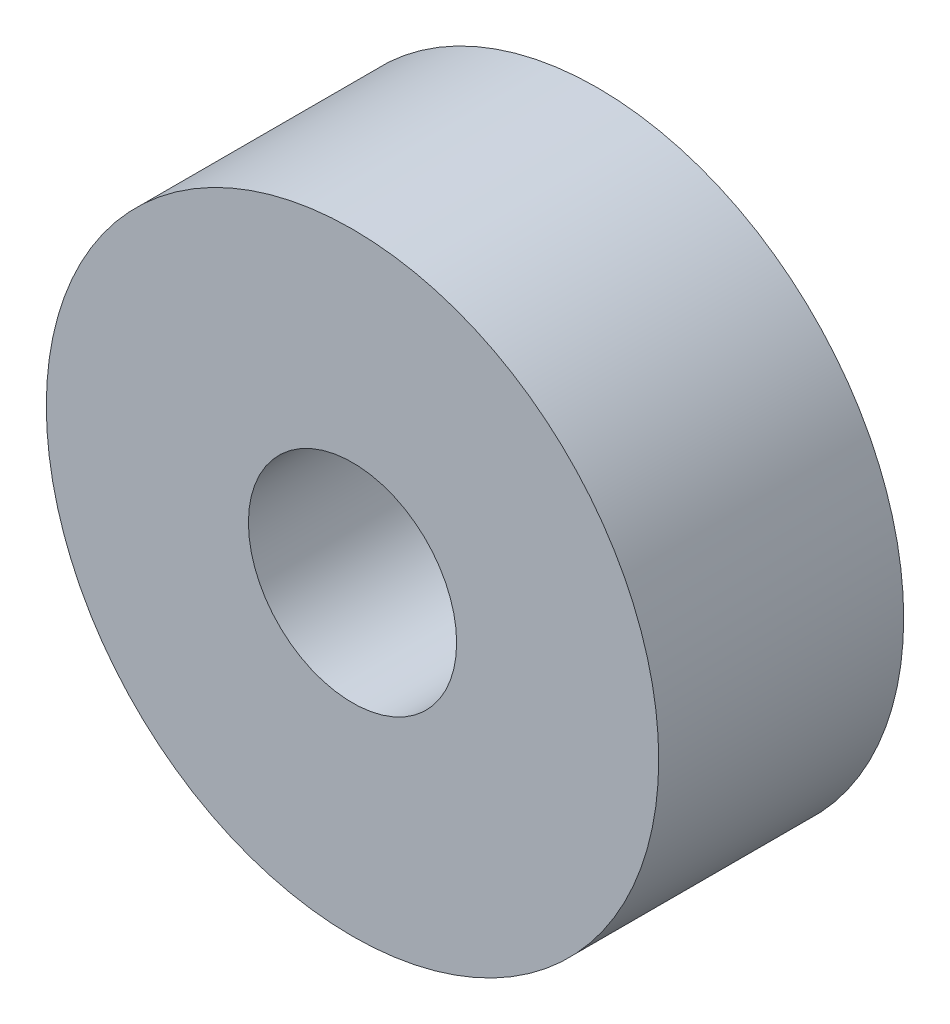
ISO-10303-21;
HEADER;
FILE_DESCRIPTION(('STEP AP214'),'2;1');
FILE_NAME('part.step','',(''),(''),'','','');
FILE_SCHEMA(('AUTOMOTIVE_DESIGN { 1 0 10303 214 1 1 1 1 }'));
ENDSEC;
DATA;
#1=APPLICATION_CONTEXT('core data for automotive mechanical design processes');
#2=APPLICATION_PROTOCOL_DEFINITION('international standard','automotive_design',2000,#1);
#3=PRODUCT_CONTEXT('',#1,'mechanical');
#4=PRODUCT('Part','Part','',(#3));
#5=PRODUCT_RELATED_PRODUCT_CATEGORY('part','',(#4));
#6=PRODUCT_DEFINITION_FORMATION('','',#4);
#7=PRODUCT_DEFINITION_CONTEXT('part definition',#1,'design');
#8=PRODUCT_DEFINITION('design','',#6,#7);
#9=PRODUCT_DEFINITION_SHAPE('','',#8);
#10=(LENGTH_UNIT() NAMED_UNIT(*) SI_UNIT(.MILLI.,.METRE.));
#11=(NAMED_UNIT(*) PLANE_ANGLE_UNIT() SI_UNIT($,.RADIAN.));
#12=(NAMED_UNIT(*) SI_UNIT($,.STERADIAN.) SOLID_ANGLE_UNIT());
#13=UNCERTAINTY_MEASURE_WITH_UNIT(LENGTH_MEASURE(1.E-05),#10,'distance_accuracy_value','');
#14=(GEOMETRIC_REPRESENTATION_CONTEXT(3) GLOBAL_UNCERTAINTY_ASSIGNED_CONTEXT((#13)) GLOBAL_UNIT_ASSIGNED_CONTEXT((#10,
#11,#12)) REPRESENTATION_CONTEXT('',''));
#15=CARTESIAN_POINT('',(0.,0.,0.));
#16=DIRECTION('',(0.,0.,1.));
#17=DIRECTION('',(1.,0.,0.));
#18=AXIS2_PLACEMENT_3D('',#15,#16,#17);
#19=CARTESIAN_POINT('',(0.,-99.9999999999998,-13.));
#20=DIRECTION('',(0.,0.,1.));
#21=DIRECTION('',(1.,0.,0.));
#22=AXIS2_PLACEMENT_3D('',#19,#20,#21);
#23=CYLINDRICAL_SURFACE('',#22,5.);
#24=CARTESIAN_POINT('',(0.,-99.9999999999998,-13.));
#25=DIRECTION('',(0.,0.,-1.));
#26=DIRECTION('',(-1.,0.,0.));
#27=AXIS2_PLACEMENT_3D('',#24,#25,#26);
#28=CIRCLE('',#27,5.);
#29=CARTESIAN_POINT('',(-4.99999999999998,-99.9999999999998,-13.));
#30=VERTEX_POINT('',#29);
#31=EDGE_CURVE('E10',#30,#30,#28,.T.);
#32=ORIENTED_EDGE('',*,*,#31,.F.);
#33=EDGE_LOOP('',(#32));
#34=FACE_BOUND('',#33,.T.);
#35=CARTESIAN_POINT('',(0.,-99.9999999999998,-9.));
#36=DIRECTION('',(0.,0.,-1.));
#37=DIRECTION('',(-1.,0.,0.));
#38=AXIS2_PLACEMENT_3D('',#35,#36,#37);
#39=CIRCLE('',#38,5.);
#40=CARTESIAN_POINT('',(-4.99999999999998,-99.9999999999998,-9.));
#41=VERTEX_POINT('',#40);
#42=EDGE_CURVE('E60',#41,#41,#39,.T.);
#43=ORIENTED_EDGE('',*,*,#42,.T.);
#44=EDGE_LOOP('',(#43));
#45=FACE_BOUND('',#44,.T.);
#46=ADVANCED_FACE('F47',(#34,#45),#23,.T.);
#47=CARTESIAN_POINT('',(0.,-99.9999999999998,-13.));
#48=DIRECTION('',(0.,0.,-1.));
#49=DIRECTION('',(-1.,0.,0.));
#50=AXIS2_PLACEMENT_3D('',#47,#48,#49);
#51=PLANE('',#50);
#52=CARTESIAN_POINT('',(0.,-99.9999999999998,-13.));
#53=DIRECTION('',(0.,0.,-1.));
#54=DIRECTION('',(-1.,0.,0.));
#55=AXIS2_PLACEMENT_3D('',#52,#53,#54);
#56=CIRCLE('',#55,3.15);
#57=CARTESIAN_POINT('',(-3.14999999999998,-99.9999999999998,-13.));
#58=VERTEX_POINT('',#57);
#59=EDGE_CURVE('E68',#58,#58,#56,.T.);
#60=ORIENTED_EDGE('',*,*,#59,.F.);
#61=EDGE_LOOP('',(#60));
#62=FACE_BOUND('',#61,.T.);
#63=ORIENTED_EDGE('',*,*,#31,.T.);
#64=EDGE_LOOP('',(#63));
#65=FACE_BOUND('',#64,.T.);
#66=ADVANCED_FACE('F76',(#62,#65),#51,.T.);
#67=CARTESIAN_POINT('',(0.,-99.9999999999998,-9.));
#68=DIRECTION('',(0.,0.,-1.));
#69=DIRECTION('',(-1.,0.,0.));
#70=AXIS2_PLACEMENT_3D('',#67,#68,#69);
#71=PLANE('',#70);
#72=CARTESIAN_POINT('',(0.,-99.9999999999998,-9.));
#73=DIRECTION('',(0.,0.,-1.));
#74=DIRECTION('',(-1.,0.,0.));
#75=AXIS2_PLACEMENT_3D('',#72,#73,#74);
#76=CIRCLE('',#75,1.69999999999999);
#77=CARTESIAN_POINT('',(-1.69999999999997,-99.9999999999998,-9.));
#78=VERTEX_POINT('',#77);
#79=EDGE_CURVE('E55',#78,#78,#76,.T.);
#80=ORIENTED_EDGE('',*,*,#79,.T.);
#81=EDGE_LOOP('',(#80));
#82=FACE_BOUND('',#81,.T.);
#83=ORIENTED_EDGE('',*,*,#42,.F.);
#84=EDGE_LOOP('',(#83));
#85=FACE_BOUND('',#84,.T.);
#86=ADVANCED_FACE('F79',(#82,#85),#71,.F.);
#87=CARTESIAN_POINT('',(0.,-99.9999999999998,-13.));
#88=DIRECTION('',(0.,0.,-1.));
#89=DIRECTION('',(-1.,0.,0.));
#90=AXIS2_PLACEMENT_3D('',#87,#88,#89);
#91=CYLINDRICAL_SURFACE('',#90,1.69999999999999);
#92=CARTESIAN_POINT('',(0.,-99.9999999999998,-11.55));
#93=DIRECTION('',(0.,0.,-1.));
#94=DIRECTION('',(-1.,0.,0.));
#95=AXIS2_PLACEMENT_3D('',#92,#93,#94);
#96=CIRCLE('',#95,1.7);
#97=CARTESIAN_POINT('',(-1.69999999999997,-99.9999999999998,-11.55));
#98=VERTEX_POINT('',#97);
#99=EDGE_CURVE('E67',#98,#98,#96,.T.);
#100=ORIENTED_EDGE('',*,*,#99,.T.);
#101=EDGE_LOOP('',(#100));
#102=FACE_BOUND('',#101,.T.);
#103=ORIENTED_EDGE('',*,*,#79,.F.);
#104=EDGE_LOOP('',(#103));
#105=FACE_BOUND('',#104,.T.);
#106=ADVANCED_FACE('F82',(#102,#105),#91,.F.);
#107=CARTESIAN_POINT('',(0.,-99.9999999999998,-13.));
#108=DIRECTION('',(0.,0.,-1.));
#109=DIRECTION('',(-1.,0.,0.));
#110=AXIS2_PLACEMENT_3D('',#107,#108,#109);
#111=CONICAL_SURFACE('',#110,3.15,0.785398163397448);
#112=ORIENTED_EDGE('',*,*,#99,.F.);
#113=EDGE_LOOP('',(#112));
#114=FACE_BOUND('',#113,.T.);
#115=ORIENTED_EDGE('',*,*,#59,.T.);
#116=EDGE_LOOP('',(#115));
#117=FACE_BOUND('',#116,.T.);
#118=ADVANCED_FACE('F78',(#114,#117),#111,.F.);
#119=CLOSED_SHELL('',(#46,#66,#86,#106,#118));
#120=MANIFOLD_SOLID_BREP('B2',#119);
#121=ADVANCED_BREP_SHAPE_REPRESENTATION('',(#18,#120),#14);
#122=SHAPE_DEFINITION_REPRESENTATION(#9,#121);
ENDSEC;
END-ISO-10303-21;
